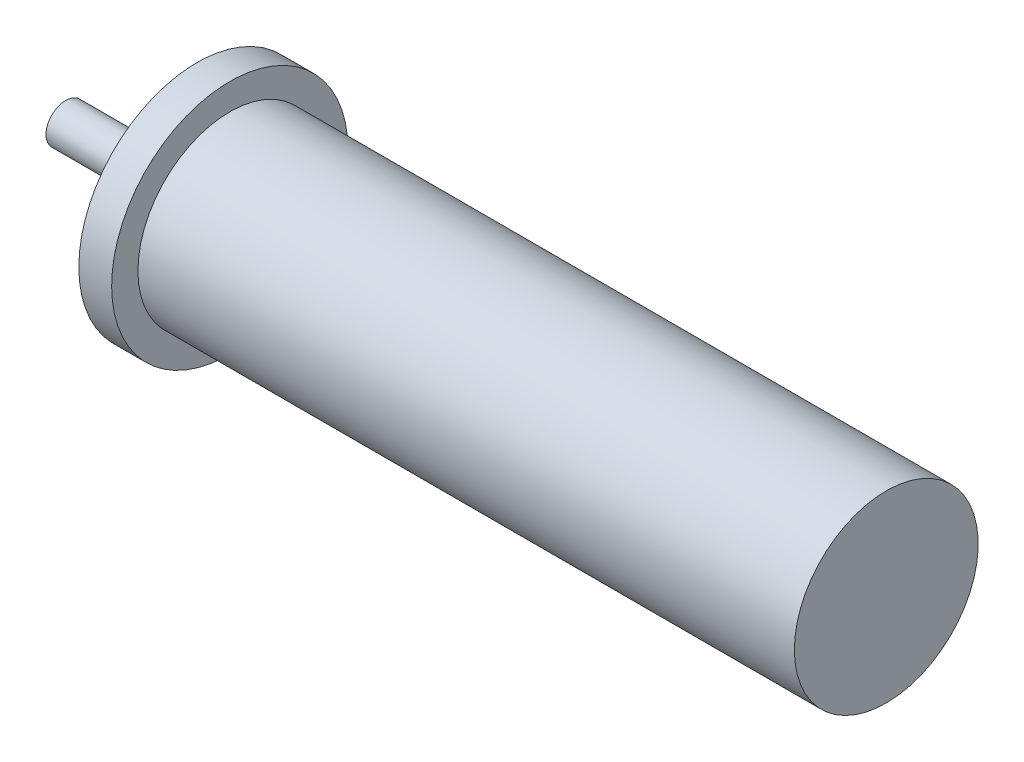
ISO-10303-21;
HEADER;
FILE_DESCRIPTION(('STEP AP214'),'2;1');
FILE_NAME('part.step','',(''),(''),'','','');
FILE_SCHEMA(('AUTOMOTIVE_DESIGN { 1 0 10303 214 1 1 1 1 }'));
ENDSEC;
DATA;
#1=APPLICATION_CONTEXT('core data for automotive mechanical design processes');
#2=APPLICATION_PROTOCOL_DEFINITION('international standard','automotive_design',2000,#1);
#3=PRODUCT_CONTEXT('',#1,'mechanical');
#4=PRODUCT('Part','Part','',(#3));
#5=PRODUCT_RELATED_PRODUCT_CATEGORY('part','',(#4));
#6=PRODUCT_DEFINITION_FORMATION('','',#4);
#7=PRODUCT_DEFINITION_CONTEXT('part definition',#1,'design');
#8=PRODUCT_DEFINITION('design','',#6,#7);
#9=PRODUCT_DEFINITION_SHAPE('','',#8);
#10=(LENGTH_UNIT() NAMED_UNIT(*) SI_UNIT(.MILLI.,.METRE.));
#11=(NAMED_UNIT(*) PLANE_ANGLE_UNIT() SI_UNIT($,.RADIAN.));
#12=(NAMED_UNIT(*) SI_UNIT($,.STERADIAN.) SOLID_ANGLE_UNIT());
#13=UNCERTAINTY_MEASURE_WITH_UNIT(LENGTH_MEASURE(1.E-05),#10,'distance_accuracy_value','');
#14=(GEOMETRIC_REPRESENTATION_CONTEXT(3) GLOBAL_UNCERTAINTY_ASSIGNED_CONTEXT((#13)) GLOBAL_UNIT_ASSIGNED_CONTEXT((#10,
#11,#12)) REPRESENTATION_CONTEXT('',''));
#15=CARTESIAN_POINT('',(0.,0.,0.));
#16=DIRECTION('',(0.,0.,1.));
#17=DIRECTION('',(1.,0.,0.));
#18=AXIS2_PLACEMENT_3D('',#15,#16,#17);
#19=CARTESIAN_POINT('',(0.,0.,0.));
#20=DIRECTION('',(-1.,0.,0.));
#21=DIRECTION('',(0.,0.,1.));
#22=AXIS2_PLACEMENT_3D('',#19,#20,#21);
#23=PLANE('',#22);
#24=CARTESIAN_POINT('',(0.,0.,0.));
#25=DIRECTION('',(-1.,0.,0.));
#26=DIRECTION('',(0.,0.,1.));
#27=AXIS2_PLACEMENT_3D('',#24,#25,#26);
#28=CIRCLE('',#27,3.);
#29=CARTESIAN_POINT('',(0.,0.,3.));
#30=VERTEX_POINT('',#29);
#31=EDGE_CURVE('E76',#30,#30,#28,.T.);
#32=ORIENTED_EDGE('',*,*,#31,.T.);
#33=EDGE_LOOP('',(#32));
#34=FACE_BOUND('',#33,.T.);
#35=ADVANCED_FACE('F41',(#34),#23,.T.);
#36=CARTESIAN_POINT('',(125.,0.,0.));
#37=DIRECTION('',(1.,0.,0.));
#38=DIRECTION('',(0.,0.,-1.));
#39=AXIS2_PLACEMENT_3D('',#36,#37,#38);
#40=PLANE('',#39);
#41=CARTESIAN_POINT('',(125.,0.,0.));
#42=DIRECTION('',(-1.,0.,0.));
#43=DIRECTION('',(0.,0.,1.));
#44=AXIS2_PLACEMENT_3D('',#41,#42,#43);
#45=CIRCLE('',#44,14.);
#46=CARTESIAN_POINT('',(125.,0.,14.));
#47=VERTEX_POINT('',#46);
#48=EDGE_CURVE('E10',#47,#47,#45,.T.);
#49=ORIENTED_EDGE('',*,*,#48,.F.);
#50=EDGE_LOOP('',(#49));
#51=FACE_BOUND('',#50,.T.);
#52=ADVANCED_FACE('F94',(#51),#40,.T.);
#53=CARTESIAN_POINT('',(0.,0.,0.));
#54=DIRECTION('',(-1.,0.,0.));
#55=DIRECTION('',(0.,0.,1.));
#56=AXIS2_PLACEMENT_3D('',#53,#54,#55);
#57=CYLINDRICAL_SURFACE('',#56,14.);
#58=ORIENTED_EDGE('',*,*,#48,.T.);
#59=EDGE_LOOP('',(#58));
#60=FACE_BOUND('',#59,.T.);
#61=CARTESIAN_POINT('',(25.,0.,0.));
#62=DIRECTION('',(-1.,0.,0.));
#63=DIRECTION('',(0.,0.,1.));
#64=AXIS2_PLACEMENT_3D('',#61,#62,#63);
#65=CIRCLE('',#64,14.);
#66=CARTESIAN_POINT('',(25.,0.,14.));
#67=VERTEX_POINT('',#66);
#68=EDGE_CURVE('E48',#67,#67,#65,.T.);
#69=ORIENTED_EDGE('',*,*,#68,.F.);
#70=EDGE_LOOP('',(#69));
#71=FACE_BOUND('',#70,.T.);
#72=ADVANCED_FACE('F98',(#60,#71),#57,.T.);
#73=CARTESIAN_POINT('',(25.,0.,0.));
#74=DIRECTION('',(1.,0.,0.));
#75=DIRECTION('',(0.,0.,-1.));
#76=AXIS2_PLACEMENT_3D('',#73,#74,#75);
#77=PLANE('',#76);
#78=ORIENTED_EDGE('',*,*,#68,.T.);
#79=EDGE_LOOP('',(#78));
#80=FACE_BOUND('',#79,.T.);
#81=CARTESIAN_POINT('',(25.,0.,0.));
#82=DIRECTION('',(-1.,0.,0.));
#83=DIRECTION('',(0.,0.,1.));
#84=AXIS2_PLACEMENT_3D('',#81,#82,#83);
#85=CIRCLE('',#84,18.);
#86=CARTESIAN_POINT('',(25.,0.,18.));
#87=VERTEX_POINT('',#86);
#88=EDGE_CURVE('E53',#87,#87,#85,.T.);
#89=ORIENTED_EDGE('',*,*,#88,.F.);
#90=EDGE_LOOP('',(#89));
#91=FACE_BOUND('',#90,.T.);
#92=ADVANCED_FACE('F103',(#80,#91),#77,.T.);
#93=CARTESIAN_POINT('',(0.,0.,0.));
#94=DIRECTION('',(-1.,0.,0.));
#95=DIRECTION('',(0.,0.,1.));
#96=AXIS2_PLACEMENT_3D('',#93,#94,#95);
#97=CYLINDRICAL_SURFACE('',#96,18.);
#98=ORIENTED_EDGE('',*,*,#88,.T.);
#99=EDGE_LOOP('',(#98));
#100=FACE_BOUND('',#99,.T.);
#101=CARTESIAN_POINT('',(20.,0.,0.));
#102=DIRECTION('',(-1.,0.,0.));
#103=DIRECTION('',(0.,0.,1.));
#104=AXIS2_PLACEMENT_3D('',#101,#102,#103);
#105=CIRCLE('',#104,18.);
#106=CARTESIAN_POINT('',(20.,0.,18.));
#107=VERTEX_POINT('',#106);
#108=EDGE_CURVE('E58',#107,#107,#105,.T.);
#109=ORIENTED_EDGE('',*,*,#108,.F.);
#110=EDGE_LOOP('',(#109));
#111=FACE_BOUND('',#110,.T.);
#112=ADVANCED_FACE('F108',(#100,#111),#97,.T.);
#113=CARTESIAN_POINT('',(20.,0.,0.));
#114=DIRECTION('',(-1.,0.,0.));
#115=DIRECTION('',(0.,0.,1.));
#116=AXIS2_PLACEMENT_3D('',#113,#114,#115);
#117=PLANE('',#116);
#118=ORIENTED_EDGE('',*,*,#108,.T.);
#119=EDGE_LOOP('',(#118));
#120=FACE_BOUND('',#119,.T.);
#121=CARTESIAN_POINT('',(20.,0.,0.));
#122=DIRECTION('',(-1.,0.,0.));
#123=DIRECTION('',(0.,0.,1.));
#124=AXIS2_PLACEMENT_3D('',#121,#122,#123);
#125=CIRCLE('',#124,11.);
#126=CARTESIAN_POINT('',(20.,0.,11.));
#127=VERTEX_POINT('',#126);
#128=EDGE_CURVE('E64',#127,#127,#125,.T.);
#129=ORIENTED_EDGE('',*,*,#128,.F.);
#130=EDGE_LOOP('',(#129));
#131=FACE_BOUND('',#130,.T.);
#132=ADVANCED_FACE('F111',(#120,#131),#117,.T.);
#133=CARTESIAN_POINT('',(0.,0.,0.));
#134=DIRECTION('',(-1.,0.,0.));
#135=DIRECTION('',(0.,0.,1.));
#136=AXIS2_PLACEMENT_3D('',#133,#134,#135);
#137=CYLINDRICAL_SURFACE('',#136,11.);
#138=ORIENTED_EDGE('',*,*,#128,.T.);
#139=EDGE_LOOP('',(#138));
#140=FACE_BOUND('',#139,.T.);
#141=CARTESIAN_POINT('',(18.,0.,0.));
#142=DIRECTION('',(-1.,0.,0.));
#143=DIRECTION('',(0.,0.,1.));
#144=AXIS2_PLACEMENT_3D('',#141,#142,#143);
#145=CIRCLE('',#144,11.);
#146=CARTESIAN_POINT('',(18.,0.,11.));
#147=VERTEX_POINT('',#146);
#148=EDGE_CURVE('E68',#147,#147,#145,.T.);
#149=ORIENTED_EDGE('',*,*,#148,.F.);
#150=EDGE_LOOP('',(#149));
#151=FACE_BOUND('',#150,.T.);
#152=ADVANCED_FACE('F90',(#140,#151),#137,.T.);
#153=CARTESIAN_POINT('',(18.,0.,0.));
#154=DIRECTION('',(-1.,0.,0.));
#155=DIRECTION('',(0.,0.,1.));
#156=AXIS2_PLACEMENT_3D('',#153,#154,#155);
#157=PLANE('',#156);
#158=ORIENTED_EDGE('',*,*,#148,.T.);
#159=EDGE_LOOP('',(#158));
#160=FACE_BOUND('',#159,.T.);
#161=CARTESIAN_POINT('',(18.,0.,0.));
#162=DIRECTION('',(-1.,0.,0.));
#163=DIRECTION('',(0.,0.,1.));
#164=AXIS2_PLACEMENT_3D('',#161,#162,#163);
#165=CIRCLE('',#164,3.);
#166=CARTESIAN_POINT('',(18.,0.,3.));
#167=VERTEX_POINT('',#166);
#168=EDGE_CURVE('E72',#167,#167,#165,.T.);
#169=ORIENTED_EDGE('',*,*,#168,.F.);
#170=EDGE_LOOP('',(#169));
#171=FACE_BOUND('',#170,.T.);
#172=ADVANCED_FACE('F84',(#160,#171),#157,.T.);
#173=CARTESIAN_POINT('',(0.,0.,0.));
#174=DIRECTION('',(-1.,0.,0.));
#175=DIRECTION('',(0.,0.,1.));
#176=AXIS2_PLACEMENT_3D('',#173,#174,#175);
#177=CYLINDRICAL_SURFACE('',#176,3.);
#178=ORIENTED_EDGE('',*,*,#168,.T.);
#179=EDGE_LOOP('',(#178));
#180=FACE_BOUND('',#179,.T.);
#181=ORIENTED_EDGE('',*,*,#31,.F.);
#182=EDGE_LOOP('',(#181));
#183=FACE_BOUND('',#182,.T.);
#184=ADVANCED_FACE('F82',(#180,#183),#177,.T.);
#185=CLOSED_SHELL('',(#35,#52,#72,#92,#112,#132,#152,#172,#184));
#186=MANIFOLD_SOLID_BREP('B2',#185);
#187=ADVANCED_BREP_SHAPE_REPRESENTATION('',(#18,#186),#14);
#188=SHAPE_DEFINITION_REPRESENTATION(#9,#187);
ENDSEC;
END-ISO-10303-21;
